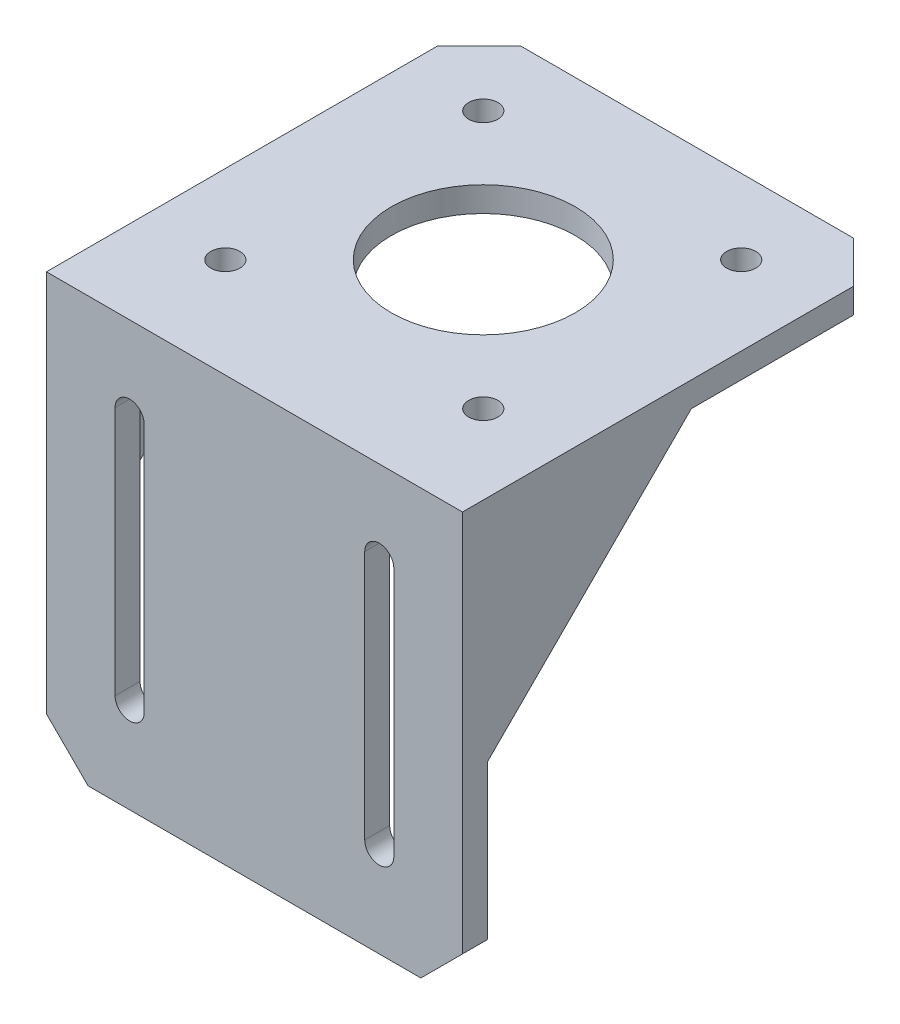
ISO-10303-21;
HEADER;
FILE_DESCRIPTION(('STEP AP214'),'2;1');
FILE_NAME('part.step','',(''),(''),'','','');
FILE_SCHEMA(('AUTOMOTIVE_DESIGN { 1 0 10303 214 1 1 1 1 }'));
ENDSEC;
DATA;
#1=APPLICATION_CONTEXT('core data for automotive mechanical design processes');
#2=APPLICATION_PROTOCOL_DEFINITION('international standard','automotive_design',2000,#1);
#3=PRODUCT_CONTEXT('',#1,'mechanical');
#4=PRODUCT('Part','Part','',(#3));
#5=PRODUCT_RELATED_PRODUCT_CATEGORY('part','',(#4));
#6=PRODUCT_DEFINITION_FORMATION('','',#4);
#7=PRODUCT_DEFINITION_CONTEXT('part definition',#1,'design');
#8=PRODUCT_DEFINITION('design','',#6,#7);
#9=PRODUCT_DEFINITION_SHAPE('','',#8);
#10=(LENGTH_UNIT() NAMED_UNIT(*) SI_UNIT(.MILLI.,.METRE.));
#11=(NAMED_UNIT(*) PLANE_ANGLE_UNIT() SI_UNIT($,.RADIAN.));
#12=(NAMED_UNIT(*) SI_UNIT($,.STERADIAN.) SOLID_ANGLE_UNIT());
#13=UNCERTAINTY_MEASURE_WITH_UNIT(LENGTH_MEASURE(1.E-05),#10,'distance_accuracy_value','');
#14=(GEOMETRIC_REPRESENTATION_CONTEXT(3) GLOBAL_UNCERTAINTY_ASSIGNED_CONTEXT((#13)) GLOBAL_UNIT_ASSIGNED_CONTEXT((#10,
#11,#12)) REPRESENTATION_CONTEXT('',''));
#15=CARTESIAN_POINT('',(0.,0.,0.));
#16=DIRECTION('',(0.,0.,1.));
#17=DIRECTION('',(1.,0.,0.));
#18=AXIS2_PLACEMENT_3D('',#15,#16,#17);
#19=CARTESIAN_POINT('',(0.,0.,0.));
#20=DIRECTION('',(0.,-1.,0.));
#21=DIRECTION('',(0.,0.,-1.));
#22=AXIS2_PLACEMENT_3D('',#19,#20,#21);
#23=PLANE('',#22);
#24=CARTESIAN_POINT('',(-15.4999999999996,0.,15.5000000000004));
#25=DIRECTION('',(0.,1.,0.));
#26=DIRECTION('',(0.,0.,1.));
#27=AXIS2_PLACEMENT_3D('',#24,#25,#26);
#28=CIRCLE('',#27,1.75000000000036);
#29=CARTESIAN_POINT('',(-15.4999999999996,0.,17.2500000000008));
#30=VERTEX_POINT('',#29);
#31=EDGE_CURVE('E305',#30,#30,#28,.T.);
#32=ORIENTED_EDGE('',*,*,#31,.T.);
#33=EDGE_LOOP('',(#32));
#34=FACE_BOUND('',#33,.T.);
#35=CARTESIAN_POINT('',(0.,0.,0.));
#36=DIRECTION('',(0.,1.,0.));
#37=DIRECTION('',(0.,0.,1.));
#38=AXIS2_PLACEMENT_3D('',#35,#36,#37);
#39=CIRCLE('',#38,11.05);
#40=CARTESIAN_POINT('',(0.,0.,11.05));
#41=VERTEX_POINT('',#40);
#42=EDGE_CURVE('E289',#41,#41,#39,.T.);
#43=ORIENTED_EDGE('',*,*,#42,.T.);
#44=EDGE_LOOP('',(#43));
#45=FACE_BOUND('',#44,.T.);
#46=CARTESIAN_POINT('',(15.5,0.,-15.5));
#47=DIRECTION('',(0.,1.,0.));
#48=DIRECTION('',(0.,0.,1.));
#49=AXIS2_PLACEMENT_3D('',#46,#47,#48);
#50=CIRCLE('',#49,1.75);
#51=CARTESIAN_POINT('',(15.5,0.,-13.75));
#52=VERTEX_POINT('',#51);
#53=EDGE_CURVE('E281',#52,#52,#50,.T.);
#54=ORIENTED_EDGE('',*,*,#53,.T.);
#55=EDGE_LOOP('',(#54));
#56=FACE_BOUND('',#55,.T.);
#57=CARTESIAN_POINT('',(15.4999999999999,0.,15.5));
#58=DIRECTION('',(0.,1.,0.));
#59=DIRECTION('',(0.,0.,1.));
#60=AXIS2_PLACEMENT_3D('',#57,#58,#59);
#61=CIRCLE('',#60,1.75);
#62=CARTESIAN_POINT('',(15.4999999999999,0.,17.25));
#63=VERTEX_POINT('',#62);
#64=EDGE_CURVE('E297',#63,#63,#61,.T.);
#65=ORIENTED_EDGE('',*,*,#64,.T.);
#66=EDGE_LOOP('',(#65));
#67=FACE_BOUND('',#66,.T.);
#68=CARTESIAN_POINT('',(-15.5,0.,-15.4999999999996));
#69=DIRECTION('',(0.,1.,0.));
#70=DIRECTION('',(0.,0.,1.));
#71=AXIS2_PLACEMENT_3D('',#68,#69,#70);
#72=CIRCLE('',#71,1.75000000000052);
#73=CARTESIAN_POINT('',(-15.5,0.,-13.749999999999));
#74=VERTEX_POINT('',#73);
#75=EDGE_CURVE('E313',#74,#74,#72,.T.);
#76=ORIENTED_EDGE('',*,*,#75,.T.);
#77=EDGE_LOOP('',(#76));
#78=FACE_BOUND('',#77,.T.);
#79=DIRECTION('',(0.,0.,1.));
#80=VECTOR('',#79,1.);
#81=CARTESIAN_POINT('',(-22.,0.,24.5));
#82=LINE('',#81,#80);
#83=CARTESIAN_POINT('',(-22.,0.,0.));
#84=VERTEX_POINT('',#83);
#85=CARTESIAN_POINT('',(-22.,0.,24.5));
#86=VERTEX_POINT('',#85);
#87=EDGE_CURVE('E201',#84,#86,#82,.T.);
#88=ORIENTED_EDGE('',*,*,#87,.F.);
#89=DIRECTION('',(-1.,0.,0.));
#90=VECTOR('',#89,1.);
#91=CARTESIAN_POINT('',(-22.,0.,0.));
#92=LINE('',#91,#90);
#93=CARTESIAN_POINT('',(-25.,0.,0.));
#94=VERTEX_POINT('',#93);
#95=EDGE_CURVE('E265',#84,#94,#92,.T.);
#96=ORIENTED_EDGE('',*,*,#95,.T.);
#97=DIRECTION('',(0.,0.,1.));
#98=VECTOR('',#97,1.);
#99=CARTESIAN_POINT('',(-25.,0.,24.5));
#100=LINE('',#99,#98);
#101=CARTESIAN_POINT('',(-25.,0.,-19.5));
#102=VERTEX_POINT('',#101);
#103=EDGE_CURVE('E227',#102,#94,#100,.T.);
#104=ORIENTED_EDGE('',*,*,#103,.F.);
#105=DIRECTION('',(-0.707106781186548,0.,0.707106781186547));
#106=VECTOR('',#105,1.);
#107=CARTESIAN_POINT('',(-25.,0.,-19.5));
#108=LINE('',#107,#106);
#109=CARTESIAN_POINT('',(-20.,0.,-24.5));
#110=VERTEX_POINT('',#109);
#111=EDGE_CURVE('E89',#110,#102,#108,.T.);
#112=ORIENTED_EDGE('',*,*,#111,.F.);
#113=DIRECTION('',(-1.,0.,0.));
#114=VECTOR('',#113,1.);
#115=CARTESIAN_POINT('',(-20.,0.,-24.5));
#116=LINE('',#115,#114);
#117=CARTESIAN_POINT('',(20.,0.,-24.5));
#118=VERTEX_POINT('',#117);
#119=EDGE_CURVE('E240',#118,#110,#116,.T.);
#120=ORIENTED_EDGE('',*,*,#119,.F.);
#121=DIRECTION('',(-0.707106781186548,0.,-0.707106781186547));
#122=VECTOR('',#121,1.);
#123=CARTESIAN_POINT('',(20.,0.,-24.5));
#124=LINE('',#123,#122);
#125=CARTESIAN_POINT('',(25.,0.,-19.5));
#126=VERTEX_POINT('',#125);
#127=EDGE_CURVE('E231',#126,#118,#124,.T.);
#128=ORIENTED_EDGE('',*,*,#127,.F.);
#129=DIRECTION('',(0.,0.,-1.));
#130=VECTOR('',#129,1.);
#131=CARTESIAN_POINT('',(25.,0.,24.5));
#132=LINE('',#131,#130);
#133=CARTESIAN_POINT('',(25.,0.,0.));
#134=VERTEX_POINT('',#133);
#135=EDGE_CURVE('E226',#134,#126,#132,.T.);
#136=ORIENTED_EDGE('',*,*,#135,.F.);
#137=DIRECTION('',(1.,0.,0.));
#138=VECTOR('',#137,1.);
#139=CARTESIAN_POINT('',(22.,0.,0.));
#140=LINE('',#139,#138);
#141=CARTESIAN_POINT('',(22.,0.,0.));
#142=VERTEX_POINT('',#141);
#143=EDGE_CURVE('E448',#142,#134,#140,.T.);
#144=ORIENTED_EDGE('',*,*,#143,.F.);
#145=DIRECTION('',(0.,0.,1.));
#146=VECTOR('',#145,1.);
#147=CARTESIAN_POINT('',(22.,0.,24.5));
#148=LINE('',#147,#146);
#149=CARTESIAN_POINT('',(22.,0.,24.5));
#150=VERTEX_POINT('',#149);
#151=EDGE_CURVE('E224',#142,#150,#148,.T.);
#152=ORIENTED_EDGE('',*,*,#151,.T.);
#153=DIRECTION('',(1.,0.,0.));
#154=VECTOR('',#153,1.);
#155=CARTESIAN_POINT('',(-25.,0.,24.5));
#156=LINE('',#155,#154);
#157=EDGE_CURVE('E215',#86,#150,#156,.T.);
#158=ORIENTED_EDGE('',*,*,#157,.F.);
#159=EDGE_LOOP('',(#88,#96,#104,#112,#120,#128,#136,#144,#152,#158));
#160=FACE_BOUND('',#159,.T.);
#161=ADVANCED_FACE('F43',(#34,#45,#56,#67,#78,#160),#23,.T.);
#162=CARTESIAN_POINT('',(0.,0.,24.5));
#163=DIRECTION('',(0.,0.,1.));
#164=DIRECTION('',(1.,0.,0.));
#165=AXIS2_PLACEMENT_3D('',#162,#163,#164);
#166=PLANE('',#165);
#167=CARTESIAN_POINT('',(15.,-6.99999999999999,24.5));
#168=DIRECTION('',(0.,0.,1.));
#169=DIRECTION('',(-1.,0.,0.));
#170=AXIS2_PLACEMENT_3D('',#167,#168,#169);
#171=CIRCLE('',#170,1.75);
#172=CARTESIAN_POINT('',(16.75,-6.99999999999999,24.5));
#173=VERTEX_POINT('',#172);
#174=CARTESIAN_POINT('',(13.25,-6.99999999999999,24.5));
#175=VERTEX_POINT('',#174);
#176=EDGE_CURVE('E444',#173,#175,#171,.T.);
#177=ORIENTED_EDGE('',*,*,#176,.T.);
#178=DIRECTION('',(0.,-1.,0.));
#179=VECTOR('',#178,1.);
#180=CARTESIAN_POINT('',(13.25,-6.99999999999999,24.5));
#181=LINE('',#180,#179);
#182=CARTESIAN_POINT('',(13.25,-37.,24.5));
#183=VERTEX_POINT('',#182);
#184=EDGE_CURVE('E440',#175,#183,#181,.T.);
#185=ORIENTED_EDGE('',*,*,#184,.T.);
#186=CARTESIAN_POINT('',(15.,-37.,24.5));
#187=DIRECTION('',(0.,0.,1.));
#188=DIRECTION('',(-1.,0.,0.));
#189=AXIS2_PLACEMENT_3D('',#186,#187,#188);
#190=CIRCLE('',#189,1.75);
#191=CARTESIAN_POINT('',(16.75,-37.,24.5));
#192=VERTEX_POINT('',#191);
#193=EDGE_CURVE('E436',#183,#192,#190,.T.);
#194=ORIENTED_EDGE('',*,*,#193,.T.);
#195=DIRECTION('',(0.,1.,0.));
#196=VECTOR('',#195,1.);
#197=CARTESIAN_POINT('',(16.75,-6.99999999999999,24.5));
#198=LINE('',#197,#196);
#199=EDGE_CURVE('E431',#192,#173,#198,.T.);
#200=ORIENTED_EDGE('',*,*,#199,.T.);
#201=EDGE_LOOP('',(#177,#185,#194,#200));
#202=FACE_BOUND('',#201,.T.);
#203=CARTESIAN_POINT('',(-15.,-7.,24.5));
#204=DIRECTION('',(0.,0.,1.));
#205=DIRECTION('',(1.,0.,0.));
#206=AXIS2_PLACEMENT_3D('',#203,#204,#205);
#207=CIRCLE('',#206,1.75);
#208=CARTESIAN_POINT('',(-13.25,-7.,24.5));
#209=VERTEX_POINT('',#208);
#210=CARTESIAN_POINT('',(-16.75,-7.,24.5));
#211=VERTEX_POINT('',#210);
#212=EDGE_CURVE('E401',#209,#211,#207,.T.);
#213=ORIENTED_EDGE('',*,*,#212,.T.);
#214=DIRECTION('',(0.,-1.,0.));
#215=VECTOR('',#214,1.);
#216=CARTESIAN_POINT('',(-16.75,-7.,24.5));
#217=LINE('',#216,#215);
#218=CARTESIAN_POINT('',(-16.75,-37.,24.5));
#219=VERTEX_POINT('',#218);
#220=EDGE_CURVE('E397',#211,#219,#217,.T.);
#221=ORIENTED_EDGE('',*,*,#220,.T.);
#222=CARTESIAN_POINT('',(-15.,-37.,24.5));
#223=DIRECTION('',(0.,0.,1.));
#224=DIRECTION('',(1.,0.,0.));
#225=AXIS2_PLACEMENT_3D('',#222,#223,#224);
#226=CIRCLE('',#225,1.75);
#227=CARTESIAN_POINT('',(-13.25,-37.,24.5));
#228=VERTEX_POINT('',#227);
#229=EDGE_CURVE('E393',#219,#228,#226,.T.);
#230=ORIENTED_EDGE('',*,*,#229,.T.);
#231=DIRECTION('',(0.,1.,0.));
#232=VECTOR('',#231,1.);
#233=CARTESIAN_POINT('',(-13.25,-7.,24.5));
#234=LINE('',#233,#232);
#235=EDGE_CURVE('E388',#228,#209,#234,.T.);
#236=ORIENTED_EDGE('',*,*,#235,.T.);
#237=EDGE_LOOP('',(#213,#221,#230,#236));
#238=FACE_BOUND('',#237,.T.);
#239=DIRECTION('',(-1.,0.,0.));
#240=VECTOR('',#239,1.);
#241=CARTESIAN_POINT('',(-22.,-24.5,24.5));
#242=LINE('',#241,#240);
#243=CARTESIAN_POINT('',(-22.,-24.5,24.5));
#244=VERTEX_POINT('',#243);
#245=CARTESIAN_POINT('',(-25.,-24.5,24.5));
#246=VERTEX_POINT('',#245);
#247=EDGE_CURVE('E59',#244,#246,#242,.T.);
#248=ORIENTED_EDGE('',*,*,#247,.F.);
#249=DIRECTION('',(0.,-1.,0.));
#250=VECTOR('',#249,1.);
#251=CARTESIAN_POINT('',(-22.,0.,24.5));
#252=LINE('',#251,#250);
#253=EDGE_CURVE('E204',#86,#244,#252,.T.);
#254=ORIENTED_EDGE('',*,*,#253,.F.);
#255=ORIENTED_EDGE('',*,*,#157,.T.);
#256=DIRECTION('',(0.,-1.,0.));
#257=VECTOR('',#256,1.);
#258=CARTESIAN_POINT('',(22.,0.,24.5));
#259=LINE('',#258,#257);
#260=CARTESIAN_POINT('',(22.,-24.5,24.5));
#261=VERTEX_POINT('',#260);
#262=EDGE_CURVE('E470',#150,#261,#259,.T.);
#263=ORIENTED_EDGE('',*,*,#262,.T.);
#264=DIRECTION('',(1.,0.,0.));
#265=VECTOR('',#264,1.);
#266=CARTESIAN_POINT('',(22.,-24.5,24.5));
#267=LINE('',#266,#265);
#268=CARTESIAN_POINT('',(25.,-24.5,24.5));
#269=VERTEX_POINT('',#268);
#270=EDGE_CURVE('E460',#261,#269,#267,.T.);
#271=ORIENTED_EDGE('',*,*,#270,.T.);
#272=DIRECTION('',(0.,1.,0.));
#273=VECTOR('',#272,1.);
#274=CARTESIAN_POINT('',(25.,3.,24.5));
#275=LINE('',#274,#273);
#276=CARTESIAN_POINT('',(25.,-43.,24.5));
#277=VERTEX_POINT('',#276);
#278=EDGE_CURVE('E337',#277,#269,#275,.T.);
#279=ORIENTED_EDGE('',*,*,#278,.F.);
#280=DIRECTION('',(0.707106781186548,0.707106781186547,0.));
#281=VECTOR('',#280,1.);
#282=CARTESIAN_POINT('',(20.,-48.,24.5));
#283=LINE('',#282,#281);
#284=CARTESIAN_POINT('',(20.,-48.,24.5));
#285=VERTEX_POINT('',#284);
#286=EDGE_CURVE('E342',#285,#277,#283,.T.);
#287=ORIENTED_EDGE('',*,*,#286,.F.);
#288=DIRECTION('',(1.,0.,0.));
#289=VECTOR('',#288,1.);
#290=CARTESIAN_POINT('',(-20.,-48.,24.5));
#291=LINE('',#290,#289);
#292=CARTESIAN_POINT('',(-20.,-48.,24.5));
#293=VERTEX_POINT('',#292);
#294=EDGE_CURVE('E345',#293,#285,#291,.T.);
#295=ORIENTED_EDGE('',*,*,#294,.F.);
#296=DIRECTION('',(0.707106781186548,-0.707106781186547,0.));
#297=VECTOR('',#296,1.);
#298=CARTESIAN_POINT('',(-25.,-43.,24.5));
#299=LINE('',#298,#297);
#300=CARTESIAN_POINT('',(-25.,-43.,24.5));
#301=VERTEX_POINT('',#300);
#302=EDGE_CURVE('E348',#301,#293,#299,.T.);
#303=ORIENTED_EDGE('',*,*,#302,.F.);
#304=DIRECTION('',(0.,-1.,0.));
#305=VECTOR('',#304,1.);
#306=CARTESIAN_POINT('',(-25.,3.,24.5));
#307=LINE('',#306,#305);
#308=EDGE_CURVE('E351',#246,#301,#307,.T.);
#309=ORIENTED_EDGE('',*,*,#308,.F.);
#310=EDGE_LOOP('',(#248,#254,#255,#263,#271,#279,#287,#295,#303,#309));
#311=FACE_BOUND('',#310,.T.);
#312=ADVANCED_FACE('F213',(#202,#238,#311),#166,.F.);
#313=CARTESIAN_POINT('',(0.,3.,0.));
#314=DIRECTION('',(0.,-1.,0.));
#315=DIRECTION('',(0.,0.,-1.));
#316=AXIS2_PLACEMENT_3D('',#313,#314,#315);
#317=PLANE('',#316);
#318=DIRECTION('',(0.,0.,1.));
#319=VECTOR('',#318,1.);
#320=CARTESIAN_POINT('',(-25.,3.,24.5));
#321=LINE('',#320,#319);
#322=CARTESIAN_POINT('',(-25.,3.,-19.5));
#323=VERTEX_POINT('',#322);
#324=CARTESIAN_POINT('',(-25.,3.,27.5));
#325=VERTEX_POINT('',#324);
#326=EDGE_CURVE('E245',#323,#325,#321,.T.);
#327=ORIENTED_EDGE('',*,*,#326,.T.);
#328=DIRECTION('',(-1.,0.,0.));
#329=VECTOR('',#328,1.);
#330=CARTESIAN_POINT('',(-25.,3.,27.5));
#331=LINE('',#330,#329);
#332=CARTESIAN_POINT('',(25.,3.,27.5));
#333=VERTEX_POINT('',#332);
#334=EDGE_CURVE('E336',#333,#325,#331,.T.);
#335=ORIENTED_EDGE('',*,*,#334,.F.);
#336=DIRECTION('',(0.,0.,-1.));
#337=VECTOR('',#336,1.);
#338=CARTESIAN_POINT('',(25.,3.,24.5));
#339=LINE('',#338,#337);
#340=CARTESIAN_POINT('',(25.,3.,-19.5));
#341=VERTEX_POINT('',#340);
#342=EDGE_CURVE('E96',#333,#341,#339,.T.);
#343=ORIENTED_EDGE('',*,*,#342,.T.);
#344=DIRECTION('',(-0.707106781186548,0.,-0.707106781186547));
#345=VECTOR('',#344,1.);
#346=CARTESIAN_POINT('',(20.,3.,-24.5));
#347=LINE('',#346,#345);
#348=CARTESIAN_POINT('',(20.,3.,-24.5));
#349=VERTEX_POINT('',#348);
#350=EDGE_CURVE('E272',#341,#349,#347,.T.);
#351=ORIENTED_EDGE('',*,*,#350,.T.);
#352=DIRECTION('',(-1.,0.,0.));
#353=VECTOR('',#352,1.);
#354=CARTESIAN_POINT('',(-20.,3.,-24.5));
#355=LINE('',#354,#353);
#356=CARTESIAN_POINT('',(-20.,3.,-24.5));
#357=VERTEX_POINT('',#356);
#358=EDGE_CURVE('E259',#349,#357,#355,.T.);
#359=ORIENTED_EDGE('',*,*,#358,.T.);
#360=DIRECTION('',(-0.707106781186548,0.,0.707106781186547));
#361=VECTOR('',#360,1.);
#362=CARTESIAN_POINT('',(-25.,3.,-19.5));
#363=LINE('',#362,#361);
#364=EDGE_CURVE('E68',#357,#323,#363,.T.);
#365=ORIENTED_EDGE('',*,*,#364,.T.);
#366=EDGE_LOOP('',(#327,#335,#343,#351,#359,#365));
#367=FACE_BOUND('',#366,.T.);
#368=CARTESIAN_POINT('',(15.5,3.,-15.5));
#369=DIRECTION('',(0.,1.,0.));
#370=DIRECTION('',(0.,0.,1.));
#371=AXIS2_PLACEMENT_3D('',#368,#369,#370);
#372=CIRCLE('',#371,1.75);
#373=CARTESIAN_POINT('',(15.5,3.,-13.75));
#374=VERTEX_POINT('',#373);
#375=EDGE_CURVE('E234',#374,#374,#372,.T.);
#376=ORIENTED_EDGE('',*,*,#375,.F.);
#377=EDGE_LOOP('',(#376));
#378=FACE_BOUND('',#377,.T.);
#379=CARTESIAN_POINT('',(0.,3.,0.));
#380=DIRECTION('',(0.,1.,0.));
#381=DIRECTION('',(0.,0.,1.));
#382=AXIS2_PLACEMENT_3D('',#379,#380,#381);
#383=CIRCLE('',#382,11.05);
#384=CARTESIAN_POINT('',(0.,3.,11.05));
#385=VERTEX_POINT('',#384);
#386=EDGE_CURVE('E285',#385,#385,#383,.T.);
#387=ORIENTED_EDGE('',*,*,#386,.F.);
#388=EDGE_LOOP('',(#387));
#389=FACE_BOUND('',#388,.T.);
#390=CARTESIAN_POINT('',(15.4999999999999,3.,15.5));
#391=DIRECTION('',(0.,1.,0.));
#392=DIRECTION('',(0.,0.,1.));
#393=AXIS2_PLACEMENT_3D('',#390,#391,#392);
#394=CIRCLE('',#393,1.75);
#395=CARTESIAN_POINT('',(15.4999999999999,3.,17.25));
#396=VERTEX_POINT('',#395);
#397=EDGE_CURVE('E293',#396,#396,#394,.T.);
#398=ORIENTED_EDGE('',*,*,#397,.F.);
#399=EDGE_LOOP('',(#398));
#400=FACE_BOUND('',#399,.T.);
#401=CARTESIAN_POINT('',(-15.4999999999996,3.,15.5000000000004));
#402=DIRECTION('',(0.,1.,0.));
#403=DIRECTION('',(0.,0.,1.));
#404=AXIS2_PLACEMENT_3D('',#401,#402,#403);
#405=CIRCLE('',#404,1.75000000000036);
#406=CARTESIAN_POINT('',(-15.4999999999996,3.,17.2500000000008));
#407=VERTEX_POINT('',#406);
#408=EDGE_CURVE('E301',#407,#407,#405,.T.);
#409=ORIENTED_EDGE('',*,*,#408,.F.);
#410=EDGE_LOOP('',(#409));
#411=FACE_BOUND('',#410,.T.);
#412=CARTESIAN_POINT('',(-15.5,3.,-15.4999999999996));
#413=DIRECTION('',(0.,1.,0.));
#414=DIRECTION('',(0.,0.,1.));
#415=AXIS2_PLACEMENT_3D('',#412,#413,#414);
#416=CIRCLE('',#415,1.75000000000052);
#417=CARTESIAN_POINT('',(-15.5,3.,-13.749999999999));
#418=VERTEX_POINT('',#417);
#419=EDGE_CURVE('E309',#418,#418,#416,.T.);
#420=ORIENTED_EDGE('',*,*,#419,.F.);
#421=EDGE_LOOP('',(#420));
#422=FACE_BOUND('',#421,.T.);
#423=ADVANCED_FACE('F503',(#367,#378,#389,#400,#411,#422),#317,.F.);
#424=CARTESIAN_POINT('',(-25.,3.,24.5));
#425=DIRECTION('',(1.,0.,0.));
#426=DIRECTION('',(0.,0.,-1.));
#427=AXIS2_PLACEMENT_3D('',#424,#425,#426);
#428=PLANE('',#427);
#429=ORIENTED_EDGE('',*,*,#103,.T.);
#430=DIRECTION('',(0.,0.707106781186547,-0.707106781186547));
#431=VECTOR('',#430,1.);
#432=CARTESIAN_POINT('',(-25.,-24.5,24.5));
#433=LINE('',#432,#431);
#434=EDGE_CURVE('E219',#246,#94,#433,.T.);
#435=ORIENTED_EDGE('',*,*,#434,.F.);
#436=ORIENTED_EDGE('',*,*,#308,.T.);
#437=DIRECTION('',(0.,0.,-1.));
#438=VECTOR('',#437,1.);
#439=CARTESIAN_POINT('',(-25.,-43.,27.5));
#440=LINE('',#439,#438);
#441=CARTESIAN_POINT('',(-25.,-43.,27.5));
#442=VERTEX_POINT('',#441);
#443=EDGE_CURVE('E317',#442,#301,#440,.T.);
#444=ORIENTED_EDGE('',*,*,#443,.F.);
#445=DIRECTION('',(0.,-1.,0.));
#446=VECTOR('',#445,1.);
#447=CARTESIAN_POINT('',(-25.,3.,27.5));
#448=LINE('',#447,#446);
#449=EDGE_CURVE('E341',#325,#442,#448,.T.);
#450=ORIENTED_EDGE('',*,*,#449,.F.);
#451=ORIENTED_EDGE('',*,*,#326,.F.);
#452=DIRECTION('',(0.,-1.,0.));
#453=VECTOR('',#452,1.);
#454=CARTESIAN_POINT('',(-25.,3.,-19.5));
#455=LINE('',#454,#453);
#456=EDGE_CURVE('E246',#323,#102,#455,.T.);
#457=ORIENTED_EDGE('',*,*,#456,.T.);
#458=EDGE_LOOP('',(#429,#435,#436,#444,#450,#451,#457));
#459=FACE_BOUND('',#458,.T.);
#460=ADVANCED_FACE('F45',(#459),#428,.F.);
#461=CARTESIAN_POINT('',(25.,3.,24.5));
#462=DIRECTION('',(-1.,0.,0.));
#463=DIRECTION('',(0.,0.,1.));
#464=AXIS2_PLACEMENT_3D('',#461,#462,#463);
#465=PLANE('',#464);
#466=DIRECTION('',(0.,0.707106781186547,-0.707106781186547));
#467=VECTOR('',#466,1.);
#468=CARTESIAN_POINT('',(25.,-24.5,24.5));
#469=LINE('',#468,#467);
#470=EDGE_CURVE('E466',#269,#134,#469,.T.);
#471=ORIENTED_EDGE('',*,*,#470,.T.);
#472=ORIENTED_EDGE('',*,*,#135,.T.);
#473=DIRECTION('',(0.,-1.,0.));
#474=VECTOR('',#473,1.);
#475=CARTESIAN_POINT('',(25.,3.,-19.5));
#476=LINE('',#475,#474);
#477=EDGE_CURVE('E11',#341,#126,#476,.T.);
#478=ORIENTED_EDGE('',*,*,#477,.F.);
#479=ORIENTED_EDGE('',*,*,#342,.F.);
#480=DIRECTION('',(0.,1.,0.));
#481=VECTOR('',#480,1.);
#482=CARTESIAN_POINT('',(25.,3.,27.5));
#483=LINE('',#482,#481);
#484=CARTESIAN_POINT('',(25.,-43.,27.5));
#485=VERTEX_POINT('',#484);
#486=EDGE_CURVE('E358',#485,#333,#483,.T.);
#487=ORIENTED_EDGE('',*,*,#486,.F.);
#488=DIRECTION('',(0.,0.,-1.));
#489=VECTOR('',#488,1.);
#490=CARTESIAN_POINT('',(25.,-43.,27.5));
#491=LINE('',#490,#489);
#492=EDGE_CURVE('E332',#485,#277,#491,.T.);
#493=ORIENTED_EDGE('',*,*,#492,.T.);
#494=ORIENTED_EDGE('',*,*,#278,.T.);
#495=EDGE_LOOP('',(#471,#472,#478,#479,#487,#493,#494));
#496=FACE_BOUND('',#495,.T.);
#497=ADVANCED_FACE('F517',(#496),#465,.F.);
#498=CARTESIAN_POINT('',(20.,3.,-24.5));
#499=DIRECTION('',(-0.707106781186547,0.,0.707106781186548));
#500=DIRECTION('',(0.707106781186548,0.,0.707106781186547));
#501=AXIS2_PLACEMENT_3D('',#498,#499,#500);
#502=PLANE('',#501);
#503=ORIENTED_EDGE('',*,*,#127,.T.);
#504=DIRECTION('',(0.,-1.,0.));
#505=VECTOR('',#504,1.);
#506=CARTESIAN_POINT('',(20.,3.,-24.5));
#507=LINE('',#506,#505);
#508=EDGE_CURVE('E52',#349,#118,#507,.T.);
#509=ORIENTED_EDGE('',*,*,#508,.F.);
#510=ORIENTED_EDGE('',*,*,#350,.F.);
#511=ORIENTED_EDGE('',*,*,#477,.T.);
#512=EDGE_LOOP('',(#503,#509,#510,#511));
#513=FACE_BOUND('',#512,.T.);
#514=ADVANCED_FACE('F515',(#513),#502,.F.);
#515=CARTESIAN_POINT('',(-20.,3.,-24.5));
#516=DIRECTION('',(0.,0.,1.));
#517=DIRECTION('',(1.,0.,0.));
#518=AXIS2_PLACEMENT_3D('',#515,#516,#517);
#519=PLANE('',#518);
#520=ORIENTED_EDGE('',*,*,#119,.T.);
#521=DIRECTION('',(0.,-1.,0.));
#522=VECTOR('',#521,1.);
#523=CARTESIAN_POINT('',(-20.,3.,-24.5));
#524=LINE('',#523,#522);
#525=EDGE_CURVE('E249',#357,#110,#524,.T.);
#526=ORIENTED_EDGE('',*,*,#525,.F.);
#527=ORIENTED_EDGE('',*,*,#358,.F.);
#528=ORIENTED_EDGE('',*,*,#508,.T.);
#529=EDGE_LOOP('',(#520,#526,#527,#528));
#530=FACE_BOUND('',#529,.T.);
#531=ADVANCED_FACE('F257',(#530),#519,.F.);
#532=CARTESIAN_POINT('',(-25.,3.,-19.5));
#533=DIRECTION('',(0.707106781186547,0.,0.707106781186548));
#534=DIRECTION('',(0.707106781186548,0.,-0.707106781186547));
#535=AXIS2_PLACEMENT_3D('',#532,#533,#534);
#536=PLANE('',#535);
#537=ORIENTED_EDGE('',*,*,#111,.T.);
#538=ORIENTED_EDGE('',*,*,#456,.F.);
#539=ORIENTED_EDGE('',*,*,#364,.F.);
#540=ORIENTED_EDGE('',*,*,#525,.T.);
#541=EDGE_LOOP('',(#537,#538,#539,#540));
#542=FACE_BOUND('',#541,.T.);
#543=ADVANCED_FACE('F269',(#542),#536,.F.);
#544=CARTESIAN_POINT('',(15.5,3.,-15.5));
#545=DIRECTION('',(0.,-1.,0.));
#546=DIRECTION('',(0.,0.,-1.));
#547=AXIS2_PLACEMENT_3D('',#544,#545,#546);
#548=CYLINDRICAL_SURFACE('',#547,1.75);
#549=ORIENTED_EDGE('',*,*,#375,.T.);
#550=EDGE_LOOP('',(#549));
#551=FACE_BOUND('',#550,.T.);
#552=ORIENTED_EDGE('',*,*,#53,.F.);
#553=EDGE_LOOP('',(#552));
#554=FACE_BOUND('',#553,.T.);
#555=ADVANCED_FACE('F512',(#551,#554),#548,.F.);
#556=CARTESIAN_POINT('',(0.,3.,0.));
#557=DIRECTION('',(0.,-1.,0.));
#558=DIRECTION('',(0.,0.,-1.));
#559=AXIS2_PLACEMENT_3D('',#556,#557,#558);
#560=CYLINDRICAL_SURFACE('',#559,11.05);
#561=ORIENTED_EDGE('',*,*,#386,.T.);
#562=EDGE_LOOP('',(#561));
#563=FACE_BOUND('',#562,.T.);
#564=ORIENTED_EDGE('',*,*,#42,.F.);
#565=EDGE_LOOP('',(#564));
#566=FACE_BOUND('',#565,.T.);
#567=ADVANCED_FACE('F571',(#563,#566),#560,.F.);
#568=CARTESIAN_POINT('',(15.4999999999999,3.,15.5));
#569=DIRECTION('',(0.,-1.,0.));
#570=DIRECTION('',(0.,0.,-1.));
#571=AXIS2_PLACEMENT_3D('',#568,#569,#570);
#572=CYLINDRICAL_SURFACE('',#571,1.75);
#573=ORIENTED_EDGE('',*,*,#397,.T.);
#574=EDGE_LOOP('',(#573));
#575=FACE_BOUND('',#574,.T.);
#576=ORIENTED_EDGE('',*,*,#64,.F.);
#577=EDGE_LOOP('',(#576));
#578=FACE_BOUND('',#577,.T.);
#579=ADVANCED_FACE('F563',(#575,#578),#572,.F.);
#580=CARTESIAN_POINT('',(-15.4999999999996,3.,15.5000000000004));
#581=DIRECTION('',(0.,-1.,0.));
#582=DIRECTION('',(0.,0.,-1.));
#583=AXIS2_PLACEMENT_3D('',#580,#581,#582);
#584=CYLINDRICAL_SURFACE('',#583,1.75000000000036);
#585=ORIENTED_EDGE('',*,*,#408,.T.);
#586=EDGE_LOOP('',(#585));
#587=FACE_BOUND('',#586,.T.);
#588=ORIENTED_EDGE('',*,*,#31,.F.);
#589=EDGE_LOOP('',(#588));
#590=FACE_BOUND('',#589,.T.);
#591=ADVANCED_FACE('F553',(#587,#590),#584,.F.);
#592=CARTESIAN_POINT('',(-15.5,3.,-15.4999999999996));
#593=DIRECTION('',(0.,-1.,0.));
#594=DIRECTION('',(0.,0.,-1.));
#595=AXIS2_PLACEMENT_3D('',#592,#593,#594);
#596=CYLINDRICAL_SURFACE('',#595,1.75000000000052);
#597=ORIENTED_EDGE('',*,*,#419,.T.);
#598=EDGE_LOOP('',(#597));
#599=FACE_BOUND('',#598,.T.);
#600=ORIENTED_EDGE('',*,*,#75,.F.);
#601=EDGE_LOOP('',(#600));
#602=FACE_BOUND('',#601,.T.);
#603=ADVANCED_FACE('F550',(#599,#602),#596,.F.);
#604=CARTESIAN_POINT('',(0.,0.,27.5));
#605=DIRECTION('',(0.,0.,1.));
#606=DIRECTION('',(1.,0.,0.));
#607=AXIS2_PLACEMENT_3D('',#604,#605,#606);
#608=PLANE('',#607);
#609=ORIENTED_EDGE('',*,*,#449,.T.);
#610=DIRECTION('',(0.707106781186548,-0.707106781186547,0.));
#611=VECTOR('',#610,1.);
#612=CARTESIAN_POINT('',(-25.,-43.,27.5));
#613=LINE('',#612,#611);
#614=CARTESIAN_POINT('',(-20.,-48.,27.5));
#615=VERTEX_POINT('',#614);
#616=EDGE_CURVE('E368',#442,#615,#613,.T.);
#617=ORIENTED_EDGE('',*,*,#616,.T.);
#618=DIRECTION('',(1.,0.,0.));
#619=VECTOR('',#618,1.);
#620=CARTESIAN_POINT('',(-20.,-48.,27.5));
#621=LINE('',#620,#619);
#622=CARTESIAN_POINT('',(20.,-48.,27.5));
#623=VERTEX_POINT('',#622);
#624=EDGE_CURVE('E365',#615,#623,#621,.T.);
#625=ORIENTED_EDGE('',*,*,#624,.T.);
#626=DIRECTION('',(0.707106781186548,0.707106781186547,0.));
#627=VECTOR('',#626,1.);
#628=CARTESIAN_POINT('',(20.,-48.,27.5));
#629=LINE('',#628,#627);
#630=EDGE_CURVE('E362',#623,#485,#629,.T.);
#631=ORIENTED_EDGE('',*,*,#630,.T.);
#632=ORIENTED_EDGE('',*,*,#486,.T.);
#633=ORIENTED_EDGE('',*,*,#334,.T.);
#634=EDGE_LOOP('',(#609,#617,#625,#631,#632,#633));
#635=FACE_BOUND('',#634,.T.);
#636=DIRECTION('',(0.,-1.,0.));
#637=VECTOR('',#636,1.);
#638=CARTESIAN_POINT('',(-16.75,-7.,27.5));
#639=LINE('',#638,#637);
#640=CARTESIAN_POINT('',(-16.75,-7.,27.5));
#641=VERTEX_POINT('',#640);
#642=CARTESIAN_POINT('',(-16.75,-37.,27.5));
#643=VERTEX_POINT('',#642);
#644=EDGE_CURVE('E412',#641,#643,#639,.T.);
#645=ORIENTED_EDGE('',*,*,#644,.F.);
#646=CARTESIAN_POINT('',(-15.,-7.,27.5));
#647=DIRECTION('',(0.,0.,1.));
#648=DIRECTION('',(1.,0.,0.));
#649=AXIS2_PLACEMENT_3D('',#646,#647,#648);
#650=CIRCLE('',#649,1.75);
#651=CARTESIAN_POINT('',(-13.25,-7.,27.5));
#652=VERTEX_POINT('',#651);
#653=EDGE_CURVE('E392',#652,#641,#650,.T.);
#654=ORIENTED_EDGE('',*,*,#653,.F.);
#655=DIRECTION('',(0.,1.,0.));
#656=VECTOR('',#655,1.);
#657=CARTESIAN_POINT('',(-13.25,-7.,27.5));
#658=LINE('',#657,#656);
#659=CARTESIAN_POINT('',(-13.25,-37.,27.5));
#660=VERTEX_POINT('',#659);
#661=EDGE_CURVE('E387',#660,#652,#658,.T.);
#662=ORIENTED_EDGE('',*,*,#661,.F.);
#663=CARTESIAN_POINT('',(-15.,-37.,27.5));
#664=DIRECTION('',(0.,0.,1.));
#665=DIRECTION('',(1.,0.,0.));
#666=AXIS2_PLACEMENT_3D('',#663,#664,#665);
#667=CIRCLE('',#666,1.75);
#668=EDGE_CURVE('E408',#643,#660,#667,.T.);
#669=ORIENTED_EDGE('',*,*,#668,.F.);
#670=EDGE_LOOP('',(#645,#654,#662,#669));
#671=FACE_BOUND('',#670,.T.);
#672=DIRECTION('',(0.,-1.,0.));
#673=VECTOR('',#672,1.);
#674=CARTESIAN_POINT('',(13.25,-6.99999999999999,27.5));
#675=LINE('',#674,#673);
#676=CARTESIAN_POINT('',(13.25,-6.99999999999999,27.5));
#677=VERTEX_POINT('',#676);
#678=CARTESIAN_POINT('',(13.25,-37.,27.5));
#679=VERTEX_POINT('',#678);
#680=EDGE_CURVE('E455',#677,#679,#675,.T.);
#681=ORIENTED_EDGE('',*,*,#680,.F.);
#682=CARTESIAN_POINT('',(15.,-6.99999999999999,27.5));
#683=DIRECTION('',(0.,0.,1.));
#684=DIRECTION('',(-1.,0.,0.));
#685=AXIS2_PLACEMENT_3D('',#682,#683,#684);
#686=CIRCLE('',#685,1.75);
#687=CARTESIAN_POINT('',(16.75,-6.99999999999999,27.5));
#688=VERTEX_POINT('',#687);
#689=EDGE_CURVE('E435',#688,#677,#686,.T.);
#690=ORIENTED_EDGE('',*,*,#689,.F.);
#691=DIRECTION('',(0.,1.,0.));
#692=VECTOR('',#691,1.);
#693=CARTESIAN_POINT('',(16.75,-6.99999999999999,27.5));
#694=LINE('',#693,#692);
#695=CARTESIAN_POINT('',(16.75,-37.,27.5));
#696=VERTEX_POINT('',#695);
#697=EDGE_CURVE('E430',#696,#688,#694,.T.);
#698=ORIENTED_EDGE('',*,*,#697,.F.);
#699=CARTESIAN_POINT('',(15.,-37.,27.5));
#700=DIRECTION('',(0.,0.,1.));
#701=DIRECTION('',(-1.,0.,0.));
#702=AXIS2_PLACEMENT_3D('',#699,#700,#701);
#703=CIRCLE('',#702,1.75);
#704=EDGE_CURVE('E451',#679,#696,#703,.T.);
#705=ORIENTED_EDGE('',*,*,#704,.F.);
#706=EDGE_LOOP('',(#681,#690,#698,#705));
#707=FACE_BOUND('',#706,.T.);
#708=ADVANCED_FACE('F536',(#635,#671,#707),#608,.T.);
#709=CARTESIAN_POINT('',(-25.,-43.,27.5));
#710=DIRECTION('',(0.707106781186547,0.707106781186548,0.));
#711=DIRECTION('',(-0.707106781186548,0.707106781186547,0.));
#712=AXIS2_PLACEMENT_3D('',#709,#710,#711);
#713=PLANE('',#712);
#714=ORIENTED_EDGE('',*,*,#302,.T.);
#715=DIRECTION('',(0.,0.,-1.));
#716=VECTOR('',#715,1.);
#717=CARTESIAN_POINT('',(-20.,-48.,27.5));
#718=LINE('',#717,#716);
#719=EDGE_CURVE('E324',#615,#293,#718,.T.);
#720=ORIENTED_EDGE('',*,*,#719,.F.);
#721=ORIENTED_EDGE('',*,*,#616,.F.);
#722=ORIENTED_EDGE('',*,*,#443,.T.);
#723=EDGE_LOOP('',(#714,#720,#721,#722));
#724=FACE_BOUND('',#723,.T.);
#725=ADVANCED_FACE('F561',(#724),#713,.F.);
#726=CARTESIAN_POINT('',(-20.,-48.,27.5));
#727=DIRECTION('',(0.,1.,0.));
#728=DIRECTION('',(0.,0.,1.));
#729=AXIS2_PLACEMENT_3D('',#726,#727,#728);
#730=PLANE('',#729);
#731=ORIENTED_EDGE('',*,*,#294,.T.);
#732=DIRECTION('',(0.,0.,-1.));
#733=VECTOR('',#732,1.);
#734=CARTESIAN_POINT('',(20.,-48.,27.5));
#735=LINE('',#734,#733);
#736=EDGE_CURVE('E328',#623,#285,#735,.T.);
#737=ORIENTED_EDGE('',*,*,#736,.F.);
#738=ORIENTED_EDGE('',*,*,#624,.F.);
#739=ORIENTED_EDGE('',*,*,#719,.T.);
#740=EDGE_LOOP('',(#731,#737,#738,#739));
#741=FACE_BOUND('',#740,.T.);
#742=ADVANCED_FACE('F630',(#741),#730,.F.);
#743=CARTESIAN_POINT('',(20.,-48.,27.5));
#744=DIRECTION('',(-0.707106781186547,0.707106781186548,0.));
#745=DIRECTION('',(-0.707106781186548,-0.707106781186547,0.));
#746=AXIS2_PLACEMENT_3D('',#743,#744,#745);
#747=PLANE('',#746);
#748=ORIENTED_EDGE('',*,*,#286,.T.);
#749=ORIENTED_EDGE('',*,*,#492,.F.);
#750=ORIENTED_EDGE('',*,*,#630,.F.);
#751=ORIENTED_EDGE('',*,*,#736,.T.);
#752=EDGE_LOOP('',(#748,#749,#750,#751));
#753=FACE_BOUND('',#752,.T.);
#754=ADVANCED_FACE('F531',(#753),#747,.F.);
#755=CARTESIAN_POINT('',(-15.,-7.,27.5));
#756=DIRECTION('',(0.,0.,-1.));
#757=DIRECTION('',(-1.,0.,0.));
#758=AXIS2_PLACEMENT_3D('',#755,#756,#757);
#759=CYLINDRICAL_SURFACE('',#758,1.75);
#760=ORIENTED_EDGE('',*,*,#212,.F.);
#761=DIRECTION('',(0.,0.,-1.));
#762=VECTOR('',#761,1.);
#763=CARTESIAN_POINT('',(-13.25,-7.,27.5));
#764=LINE('',#763,#762);
#765=EDGE_CURVE('E383',#652,#209,#764,.T.);
#766=ORIENTED_EDGE('',*,*,#765,.F.);
#767=ORIENTED_EDGE('',*,*,#653,.T.);
#768=DIRECTION('',(0.,0.,-1.));
#769=VECTOR('',#768,1.);
#770=CARTESIAN_POINT('',(-16.75,-7.,27.5));
#771=LINE('',#770,#769);
#772=EDGE_CURVE('E354',#641,#211,#771,.T.);
#773=ORIENTED_EDGE('',*,*,#772,.T.);
#774=EDGE_LOOP('',(#760,#766,#767,#773));
#775=FACE_BOUND('',#774,.T.);
#776=ADVANCED_FACE('F649',(#775),#759,.F.);
#777=CARTESIAN_POINT('',(-16.75,-7.,27.5));
#778=DIRECTION('',(1.,0.,0.));
#779=DIRECTION('',(0.,1.,0.));
#780=AXIS2_PLACEMENT_3D('',#777,#778,#779);
#781=PLANE('',#780);
#782=ORIENTED_EDGE('',*,*,#220,.F.);
#783=ORIENTED_EDGE('',*,*,#772,.F.);
#784=ORIENTED_EDGE('',*,*,#644,.T.);
#785=DIRECTION('',(0.,0.,-1.));
#786=VECTOR('',#785,1.);
#787=CARTESIAN_POINT('',(-16.75,-37.,27.5));
#788=LINE('',#787,#786);
#789=EDGE_CURVE('E377',#643,#219,#788,.T.);
#790=ORIENTED_EDGE('',*,*,#789,.T.);
#791=EDGE_LOOP('',(#782,#783,#784,#790));
#792=FACE_BOUND('',#791,.T.);
#793=ADVANCED_FACE('F659',(#792),#781,.T.);
#794=CARTESIAN_POINT('',(-15.,-37.,27.5));
#795=DIRECTION('',(0.,0.,-1.));
#796=DIRECTION('',(-1.,0.,0.));
#797=AXIS2_PLACEMENT_3D('',#794,#795,#796);
#798=CYLINDRICAL_SURFACE('',#797,1.75);
#799=ORIENTED_EDGE('',*,*,#229,.F.);
#800=ORIENTED_EDGE('',*,*,#789,.F.);
#801=ORIENTED_EDGE('',*,*,#668,.T.);
#802=DIRECTION('',(0.,0.,-1.));
#803=VECTOR('',#802,1.);
#804=CARTESIAN_POINT('',(-13.25,-37.,27.5));
#805=LINE('',#804,#803);
#806=EDGE_CURVE('E380',#660,#228,#805,.T.);
#807=ORIENTED_EDGE('',*,*,#806,.T.);
#808=EDGE_LOOP('',(#799,#800,#801,#807));
#809=FACE_BOUND('',#808,.T.);
#810=ADVANCED_FACE('F670',(#809),#798,.F.);
#811=CARTESIAN_POINT('',(-13.25,-7.,27.5));
#812=DIRECTION('',(-1.,0.,0.));
#813=DIRECTION('',(0.,-1.,0.));
#814=AXIS2_PLACEMENT_3D('',#811,#812,#813);
#815=PLANE('',#814);
#816=ORIENTED_EDGE('',*,*,#235,.F.);
#817=ORIENTED_EDGE('',*,*,#806,.F.);
#818=ORIENTED_EDGE('',*,*,#661,.T.);
#819=ORIENTED_EDGE('',*,*,#765,.T.);
#820=EDGE_LOOP('',(#816,#817,#818,#819));
#821=FACE_BOUND('',#820,.T.);
#822=ADVANCED_FACE('F681',(#821),#815,.T.);
#823=CARTESIAN_POINT('',(15.,-6.99999999999999,27.5));
#824=DIRECTION('',(0.,0.,-1.));
#825=DIRECTION('',(-1.,0.,0.));
#826=AXIS2_PLACEMENT_3D('',#823,#824,#825);
#827=CYLINDRICAL_SURFACE('',#826,1.75);
#828=ORIENTED_EDGE('',*,*,#176,.F.);
#829=DIRECTION('',(0.,0.,-1.));
#830=VECTOR('',#829,1.);
#831=CARTESIAN_POINT('',(16.75,-6.99999999999999,27.5));
#832=LINE('',#831,#830);
#833=EDGE_CURVE('E426',#688,#173,#832,.T.);
#834=ORIENTED_EDGE('',*,*,#833,.F.);
#835=ORIENTED_EDGE('',*,*,#689,.T.);
#836=DIRECTION('',(0.,0.,-1.));
#837=VECTOR('',#836,1.);
#838=CARTESIAN_POINT('',(13.25,-6.99999999999999,27.5));
#839=LINE('',#838,#837);
#840=EDGE_CURVE('E405',#677,#175,#839,.T.);
#841=ORIENTED_EDGE('',*,*,#840,.T.);
#842=EDGE_LOOP('',(#828,#834,#835,#841));
#843=FACE_BOUND('',#842,.T.);
#844=ADVANCED_FACE('F692',(#843),#827,.F.);
#845=CARTESIAN_POINT('',(13.25,-6.99999999999999,27.5));
#846=DIRECTION('',(1.,0.,0.));
#847=DIRECTION('',(0.,1.,0.));
#848=AXIS2_PLACEMENT_3D('',#845,#846,#847);
#849=PLANE('',#848);
#850=ORIENTED_EDGE('',*,*,#184,.F.);
#851=ORIENTED_EDGE('',*,*,#840,.F.);
#852=ORIENTED_EDGE('',*,*,#680,.T.);
#853=DIRECTION('',(0.,0.,-1.));
#854=VECTOR('',#853,1.);
#855=CARTESIAN_POINT('',(13.25,-37.,27.5));
#856=LINE('',#855,#854);
#857=EDGE_CURVE('E420',#679,#183,#856,.T.);
#858=ORIENTED_EDGE('',*,*,#857,.T.);
#859=EDGE_LOOP('',(#850,#851,#852,#858));
#860=FACE_BOUND('',#859,.T.);
#861=ADVANCED_FACE('F703',(#860),#849,.T.);
#862=CARTESIAN_POINT('',(15.,-37.,27.5));
#863=DIRECTION('',(0.,0.,-1.));
#864=DIRECTION('',(-1.,0.,0.));
#865=AXIS2_PLACEMENT_3D('',#862,#863,#864);
#866=CYLINDRICAL_SURFACE('',#865,1.75);
#867=ORIENTED_EDGE('',*,*,#193,.F.);
#868=ORIENTED_EDGE('',*,*,#857,.F.);
#869=ORIENTED_EDGE('',*,*,#704,.T.);
#870=DIRECTION('',(0.,0.,-1.));
#871=VECTOR('',#870,1.);
#872=CARTESIAN_POINT('',(16.75,-37.,27.5));
#873=LINE('',#872,#871);
#874=EDGE_CURVE('E423',#696,#192,#873,.T.);
#875=ORIENTED_EDGE('',*,*,#874,.T.);
#876=EDGE_LOOP('',(#867,#868,#869,#875));
#877=FACE_BOUND('',#876,.T.);
#878=ADVANCED_FACE('F714',(#877),#866,.F.);
#879=CARTESIAN_POINT('',(16.75,-6.99999999999999,27.5));
#880=DIRECTION('',(-1.,0.,0.));
#881=DIRECTION('',(0.,-1.,0.));
#882=AXIS2_PLACEMENT_3D('',#879,#880,#881);
#883=PLANE('',#882);
#884=ORIENTED_EDGE('',*,*,#199,.F.);
#885=ORIENTED_EDGE('',*,*,#874,.F.);
#886=ORIENTED_EDGE('',*,*,#697,.T.);
#887=ORIENTED_EDGE('',*,*,#833,.T.);
#888=EDGE_LOOP('',(#884,#885,#886,#887));
#889=FACE_BOUND('',#888,.T.);
#890=ADVANCED_FACE('F725',(#889),#883,.T.);
#891=CARTESIAN_POINT('',(22.,-24.5,24.5));
#892=DIRECTION('',(0.,-0.707106781186547,-0.707106781186548));
#893=DIRECTION('',(0.,0.707106781186548,-0.707106781186547));
#894=AXIS2_PLACEMENT_3D('',#891,#892,#893);
#895=PLANE('',#894);
#896=ORIENTED_EDGE('',*,*,#470,.F.);
#897=ORIENTED_EDGE('',*,*,#270,.F.);
#898=DIRECTION('',(0.,0.707106781186547,-0.707106781186547));
#899=VECTOR('',#898,1.);
#900=CARTESIAN_POINT('',(22.,-24.5,24.5));
#901=LINE('',#900,#899);
#902=EDGE_CURVE('E473',#261,#142,#901,.T.);
#903=ORIENTED_EDGE('',*,*,#902,.T.);
#904=ORIENTED_EDGE('',*,*,#143,.T.);
#905=EDGE_LOOP('',(#896,#897,#903,#904));
#906=FACE_BOUND('',#905,.T.);
#907=ADVANCED_FACE('F494',(#906),#895,.T.);
#908=CARTESIAN_POINT('',(22.,0.,0.));
#909=DIRECTION('',(1.,0.,0.));
#910=DIRECTION('',(0.,0.,-1.));
#911=AXIS2_PLACEMENT_3D('',#908,#909,#910);
#912=PLANE('',#911);
#913=ORIENTED_EDGE('',*,*,#262,.F.);
#914=ORIENTED_EDGE('',*,*,#151,.F.);
#915=ORIENTED_EDGE('',*,*,#902,.F.);
#916=EDGE_LOOP('',(#913,#914,#915));
#917=FACE_BOUND('',#916,.T.);
#918=ADVANCED_FACE('F487',(#917),#912,.F.);
#919=CARTESIAN_POINT('',(-22.,-24.5,24.5));
#920=DIRECTION('',(0.,0.707106781186547,0.707106781186548));
#921=DIRECTION('',(0.,-0.707106781186548,0.707106781186547));
#922=AXIS2_PLACEMENT_3D('',#919,#920,#921);
#923=PLANE('',#922);
#924=ORIENTED_EDGE('',*,*,#434,.T.);
#925=ORIENTED_EDGE('',*,*,#95,.F.);
#926=DIRECTION('',(0.,0.707106781186547,-0.707106781186547));
#927=VECTOR('',#926,1.);
#928=CARTESIAN_POINT('',(-22.,-24.5,24.5));
#929=LINE('',#928,#927);
#930=EDGE_CURVE('E205',#244,#84,#929,.T.);
#931=ORIENTED_EDGE('',*,*,#930,.F.);
#932=ORIENTED_EDGE('',*,*,#247,.T.);
#933=EDGE_LOOP('',(#924,#925,#931,#932));
#934=FACE_BOUND('',#933,.T.);
#935=ADVANCED_FACE('F485',(#934),#923,.F.);
#936=CARTESIAN_POINT('',(-22.,0.,0.));
#937=DIRECTION('',(-1.,0.,0.));
#938=DIRECTION('',(0.,0.,-1.));
#939=AXIS2_PLACEMENT_3D('',#936,#937,#938);
#940=PLANE('',#939);
#941=ORIENTED_EDGE('',*,*,#253,.T.);
#942=ORIENTED_EDGE('',*,*,#930,.T.);
#943=ORIENTED_EDGE('',*,*,#87,.T.);
#944=EDGE_LOOP('',(#941,#942,#943));
#945=FACE_BOUND('',#944,.T.);
#946=ADVANCED_FACE('F203',(#945),#940,.F.);
#947=CLOSED_SHELL('',(#161,#312,#423,#460,#497,#514,#531,#543,#555,#567,#579,#591,#603,#708,
#725,#742,#754,#776,#793,#810,#822,#844,#861,#878,#890,#907,#918,#935,#946));
#948=MANIFOLD_SOLID_BREP('B2',#947);
#949=ADVANCED_BREP_SHAPE_REPRESENTATION('',(#18,#948),#14);
#950=SHAPE_DEFINITION_REPRESENTATION(#9,#949);
ENDSEC;
END-ISO-10303-21;
